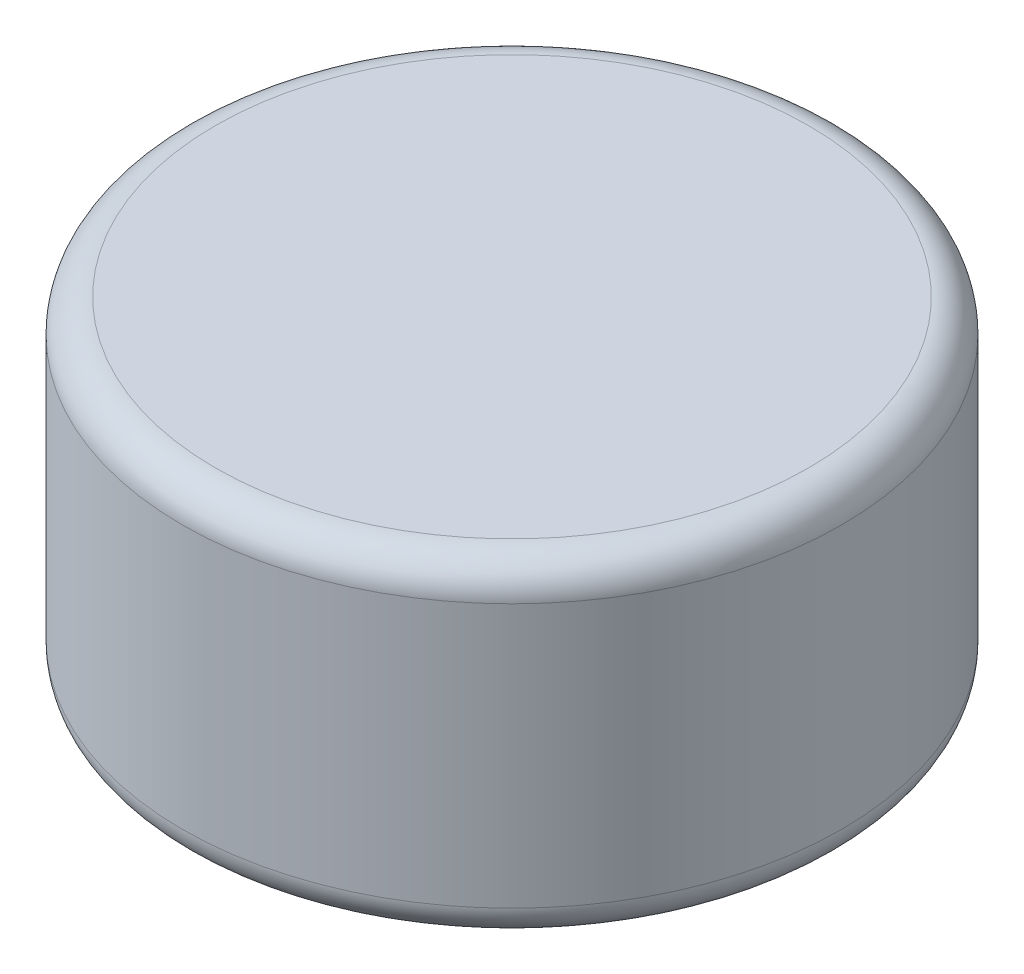
ISO-10303-21;
HEADER;
FILE_DESCRIPTION(('STEP AP214'),'2;1');
FILE_NAME('part.step','',(''),(''),'','','');
FILE_SCHEMA(('AUTOMOTIVE_DESIGN { 1 0 10303 214 1 1 1 1 }'));
ENDSEC;
DATA;
#1=APPLICATION_CONTEXT('core data for automotive mechanical design processes');
#2=APPLICATION_PROTOCOL_DEFINITION('international standard','automotive_design',2000,#1);
#3=PRODUCT_CONTEXT('',#1,'mechanical');
#4=PRODUCT('Part','Part','',(#3));
#5=PRODUCT_RELATED_PRODUCT_CATEGORY('part','',(#4));
#6=PRODUCT_DEFINITION_FORMATION('','',#4);
#7=PRODUCT_DEFINITION_CONTEXT('part definition',#1,'design');
#8=PRODUCT_DEFINITION('design','',#6,#7);
#9=PRODUCT_DEFINITION_SHAPE('','',#8);
#10=(LENGTH_UNIT() NAMED_UNIT(*) SI_UNIT(.MILLI.,.METRE.));
#11=(NAMED_UNIT(*) PLANE_ANGLE_UNIT() SI_UNIT($,.RADIAN.));
#12=(NAMED_UNIT(*) SI_UNIT($,.STERADIAN.) SOLID_ANGLE_UNIT());
#13=UNCERTAINTY_MEASURE_WITH_UNIT(LENGTH_MEASURE(1.E-05),#10,'distance_accuracy_value','');
#14=(GEOMETRIC_REPRESENTATION_CONTEXT(3) GLOBAL_UNCERTAINTY_ASSIGNED_CONTEXT((#13)) GLOBAL_UNIT_ASSIGNED_CONTEXT((#10,
#11,#12)) REPRESENTATION_CONTEXT('',''));
#15=CARTESIAN_POINT('',(0.,0.,0.));
#16=DIRECTION('',(0.,0.,1.));
#17=DIRECTION('',(1.,0.,0.));
#18=AXIS2_PLACEMENT_3D('',#15,#16,#17);
#19=CARTESIAN_POINT('',(0.,5.,0.));
#20=DIRECTION('',(0.,-1.,0.));
#21=DIRECTION('',(0.,0.,-1.));
#22=AXIS2_PLACEMENT_3D('',#19,#20,#21);
#23=CYLINDRICAL_SURFACE('',#22,5.);
#24=CARTESIAN_POINT('',(0.,0.5,0.));
#25=DIRECTION('',(0.,1.,0.));
#26=DIRECTION('',(0.,0.,1.));
#27=AXIS2_PLACEMENT_3D('',#24,#25,#26);
#28=CIRCLE('',#27,5.);
#29=CARTESIAN_POINT('',(0.,0.5,5.));
#30=VERTEX_POINT('',#29);
#31=EDGE_CURVE('E42',#30,#30,#28,.T.);
#32=ORIENTED_EDGE('',*,*,#31,.T.);
#33=EDGE_LOOP('',(#32));
#34=FACE_BOUND('',#33,.T.);
#35=CARTESIAN_POINT('',(0.,4.5,0.));
#36=DIRECTION('',(0.,1.,0.));
#37=DIRECTION('',(0.,0.,1.));
#38=AXIS2_PLACEMENT_3D('',#35,#36,#37);
#39=CIRCLE('',#38,5.);
#40=CARTESIAN_POINT('',(0.,4.5,5.));
#41=VERTEX_POINT('',#40);
#42=EDGE_CURVE('E46',#41,#41,#39,.F.);
#43=ORIENTED_EDGE('',*,*,#42,.T.);
#44=EDGE_LOOP('',(#43));
#45=FACE_BOUND('',#44,.T.);
#46=ADVANCED_FACE('F31',(#34,#45),#23,.T.);
#47=CARTESIAN_POINT('',(0.,5.,0.));
#48=DIRECTION('',(0.,1.,0.));
#49=DIRECTION('',(0.,0.,1.));
#50=AXIS2_PLACEMENT_3D('',#47,#48,#49);
#51=PLANE('',#50);
#52=CARTESIAN_POINT('',(0.,5.,0.));
#53=DIRECTION('',(0.,1.,0.));
#54=DIRECTION('',(0.,0.,1.));
#55=AXIS2_PLACEMENT_3D('',#52,#53,#54);
#56=CIRCLE('',#55,4.5);
#57=CARTESIAN_POINT('',(0.,5.,4.5));
#58=VERTEX_POINT('',#57);
#59=EDGE_CURVE('E10',#58,#58,#56,.T.);
#60=ORIENTED_EDGE('',*,*,#59,.T.);
#61=EDGE_LOOP('',(#60));
#62=FACE_BOUND('',#61,.T.);
#63=ADVANCED_FACE('F62',(#62),#51,.T.);
#64=CARTESIAN_POINT('',(0.,0.,0.));
#65=DIRECTION('',(0.,1.,0.));
#66=DIRECTION('',(0.,0.,1.));
#67=AXIS2_PLACEMENT_3D('',#64,#65,#66);
#68=PLANE('',#67);
#69=CARTESIAN_POINT('',(0.,0.,0.));
#70=DIRECTION('',(0.,1.,0.));
#71=DIRECTION('',(0.,0.,1.));
#72=AXIS2_PLACEMENT_3D('',#69,#70,#71);
#73=CIRCLE('',#72,4.5);
#74=CARTESIAN_POINT('',(0.,0.,4.5));
#75=VERTEX_POINT('',#74);
#76=EDGE_CURVE('E38',#75,#75,#73,.F.);
#77=ORIENTED_EDGE('',*,*,#76,.T.);
#78=EDGE_LOOP('',(#77));
#79=FACE_BOUND('',#78,.T.);
#80=ADVANCED_FACE('F59',(#79),#68,.F.);
#81=CARTESIAN_POINT('',(0.,0.5,0.));
#82=DIRECTION('',(0.,1.,0.));
#83=DIRECTION('',(0.,0.,1.));
#84=AXIS2_PLACEMENT_3D('',#81,#82,#83);
#85=TOROIDAL_SURFACE('',#84,4.5,0.5);
#86=ORIENTED_EDGE('',*,*,#76,.F.);
#87=EDGE_LOOP('',(#86));
#88=FACE_BOUND('',#87,.T.);
#89=ORIENTED_EDGE('',*,*,#31,.F.);
#90=EDGE_LOOP('',(#89));
#91=FACE_BOUND('',#90,.T.);
#92=ADVANCED_FACE('F55',(#88,#91),#85,.T.);
#93=CARTESIAN_POINT('',(0.,4.5,0.));
#94=DIRECTION('',(0.,1.,0.));
#95=DIRECTION('',(0.,0.,1.));
#96=AXIS2_PLACEMENT_3D('',#93,#94,#95);
#97=TOROIDAL_SURFACE('',#96,4.5,0.5);
#98=ORIENTED_EDGE('',*,*,#42,.F.);
#99=EDGE_LOOP('',(#98));
#100=FACE_BOUND('',#99,.T.);
#101=ORIENTED_EDGE('',*,*,#59,.F.);
#102=EDGE_LOOP('',(#101));
#103=FACE_BOUND('',#102,.T.);
#104=ADVANCED_FACE('F33',(#100,#103),#97,.T.);
#105=CLOSED_SHELL('',(#46,#63,#80,#92,#104));
#106=MANIFOLD_SOLID_BREP('B2',#105);
#107=ADVANCED_BREP_SHAPE_REPRESENTATION('',(#18,#106),#14);
#108=SHAPE_DEFINITION_REPRESENTATION(#9,#107);
ENDSEC;
END-ISO-10303-21;
